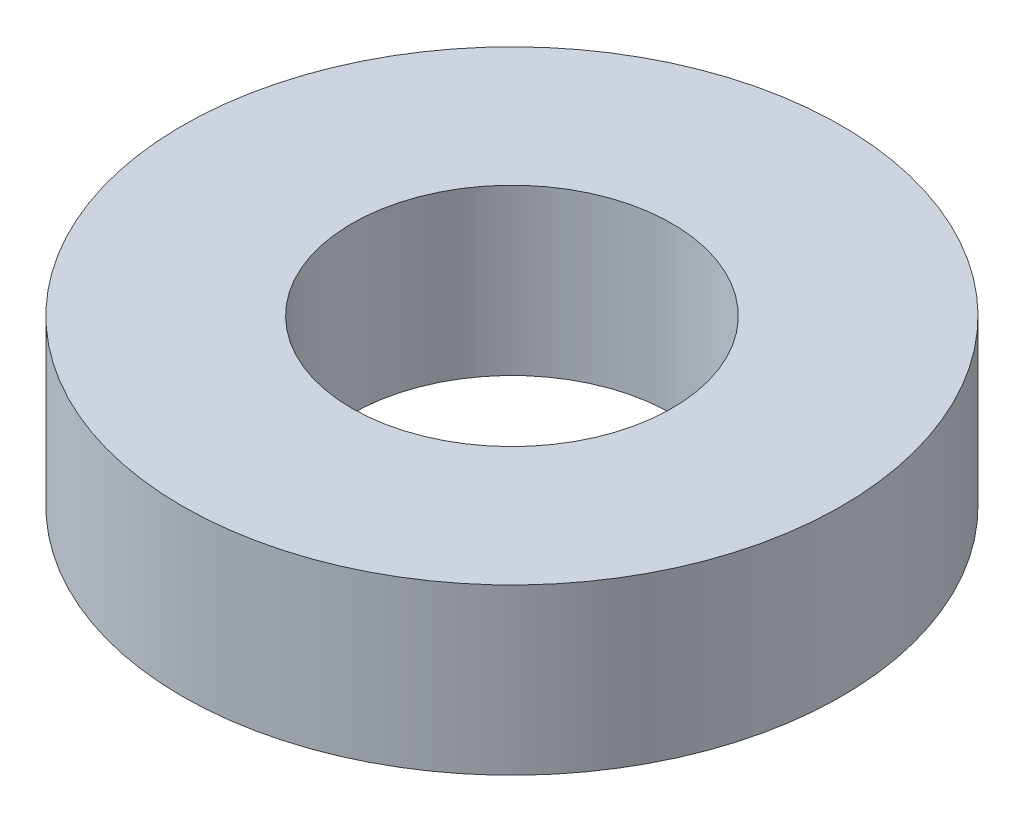
ISO-10303-21;
HEADER;
FILE_DESCRIPTION(('STEP AP214'),'2;1');
FILE_NAME('part.step','',(''),(''),'','','');
FILE_SCHEMA(('AUTOMOTIVE_DESIGN { 1 0 10303 214 1 1 1 1 }'));
ENDSEC;
DATA;
#1=APPLICATION_CONTEXT('core data for automotive mechanical design processes');
#2=APPLICATION_PROTOCOL_DEFINITION('international standard','automotive_design',2000,#1);
#3=PRODUCT_CONTEXT('',#1,'mechanical');
#4=PRODUCT('Part','Part','',(#3));
#5=PRODUCT_RELATED_PRODUCT_CATEGORY('part','',(#4));
#6=PRODUCT_DEFINITION_FORMATION('','',#4);
#7=PRODUCT_DEFINITION_CONTEXT('part definition',#1,'design');
#8=PRODUCT_DEFINITION('design','',#6,#7);
#9=PRODUCT_DEFINITION_SHAPE('','',#8);
#10=(LENGTH_UNIT() NAMED_UNIT(*) SI_UNIT(.MILLI.,.METRE.));
#11=(NAMED_UNIT(*) PLANE_ANGLE_UNIT() SI_UNIT($,.RADIAN.));
#12=(NAMED_UNIT(*) SI_UNIT($,.STERADIAN.) SOLID_ANGLE_UNIT());
#13=UNCERTAINTY_MEASURE_WITH_UNIT(LENGTH_MEASURE(1.E-05),#10,'distance_accuracy_value','');
#14=(GEOMETRIC_REPRESENTATION_CONTEXT(3) GLOBAL_UNCERTAINTY_ASSIGNED_CONTEXT((#13)) GLOBAL_UNIT_ASSIGNED_CONTEXT((#10,
#11,#12)) REPRESENTATION_CONTEXT('',''));
#15=CARTESIAN_POINT('',(0.,0.,0.));
#16=DIRECTION('',(0.,0.,1.));
#17=DIRECTION('',(1.,0.,0.));
#18=AXIS2_PLACEMENT_3D('',#15,#16,#17);
#19=CARTESIAN_POINT('',(0.,1.75,0.));
#20=DIRECTION('',(0.,1.,0.));
#21=DIRECTION('',(0.,0.,1.));
#22=AXIS2_PLACEMENT_3D('',#19,#20,#21);
#23=PLANE('',#22);
#24=CARTESIAN_POINT('',(0.,1.75,0.));
#25=DIRECTION('',(0.,1.,0.));
#26=DIRECTION('',(0.,0.,1.));
#27=AXIS2_PLACEMENT_3D('',#24,#25,#26);
#28=CIRCLE('',#27,3.5);
#29=CARTESIAN_POINT('',(0.,1.75,3.5));
#30=VERTEX_POINT('',#29);
#31=EDGE_CURVE('E10',#30,#30,#28,.T.);
#32=ORIENTED_EDGE('',*,*,#31,.T.);
#33=EDGE_LOOP('',(#32));
#34=FACE_BOUND('',#33,.T.);
#35=CARTESIAN_POINT('',(0.,1.75,0.));
#36=DIRECTION('',(0.,1.,0.));
#37=DIRECTION('',(0.,0.,1.));
#38=AXIS2_PLACEMENT_3D('',#35,#36,#37);
#39=CIRCLE('',#38,1.7);
#40=CARTESIAN_POINT('',(0.,1.75,1.7));
#41=VERTEX_POINT('',#40);
#42=EDGE_CURVE('E48',#41,#41,#39,.T.);
#43=ORIENTED_EDGE('',*,*,#42,.F.);
#44=EDGE_LOOP('',(#43));
#45=FACE_BOUND('',#44,.T.);
#46=ADVANCED_FACE('F40',(#34,#45),#23,.T.);
#47=CARTESIAN_POINT('',(0.,0.,0.));
#48=DIRECTION('',(0.,1.,0.));
#49=DIRECTION('',(0.,0.,1.));
#50=AXIS2_PLACEMENT_3D('',#47,#48,#49);
#51=PLANE('',#50);
#52=CARTESIAN_POINT('',(0.,0.,0.));
#53=DIRECTION('',(0.,1.,0.));
#54=DIRECTION('',(0.,0.,1.));
#55=AXIS2_PLACEMENT_3D('',#52,#53,#54);
#56=CIRCLE('',#55,3.5);
#57=CARTESIAN_POINT('',(0.,0.,3.5));
#58=VERTEX_POINT('',#57);
#59=EDGE_CURVE('E41',#58,#58,#56,.T.);
#60=ORIENTED_EDGE('',*,*,#59,.F.);
#61=EDGE_LOOP('',(#60));
#62=FACE_BOUND('',#61,.T.);
#63=CARTESIAN_POINT('',(0.,0.,0.));
#64=DIRECTION('',(0.,1.,0.));
#65=DIRECTION('',(0.,0.,1.));
#66=AXIS2_PLACEMENT_3D('',#63,#64,#65);
#67=CIRCLE('',#66,1.7);
#68=CARTESIAN_POINT('',(0.,0.,1.7));
#69=VERTEX_POINT('',#68);
#70=EDGE_CURVE('E49',#69,#69,#67,.T.);
#71=ORIENTED_EDGE('',*,*,#70,.T.);
#72=EDGE_LOOP('',(#71));
#73=FACE_BOUND('',#72,.T.);
#74=ADVANCED_FACE('F58',(#62,#73),#51,.F.);
#75=CARTESIAN_POINT('',(0.,1.75,0.));
#76=DIRECTION('',(0.,-1.,0.));
#77=DIRECTION('',(0.,0.,-1.));
#78=AXIS2_PLACEMENT_3D('',#75,#76,#77);
#79=CYLINDRICAL_SURFACE('',#78,3.5);
#80=ORIENTED_EDGE('',*,*,#31,.F.);
#81=EDGE_LOOP('',(#80));
#82=FACE_BOUND('',#81,.T.);
#83=ORIENTED_EDGE('',*,*,#59,.T.);
#84=EDGE_LOOP('',(#83));
#85=FACE_BOUND('',#84,.T.);
#86=ADVANCED_FACE('F39',(#82,#85),#79,.T.);
#87=CARTESIAN_POINT('',(0.,1.75,0.));
#88=DIRECTION('',(0.,-1.,0.));
#89=DIRECTION('',(0.,0.,-1.));
#90=AXIS2_PLACEMENT_3D('',#87,#88,#89);
#91=CYLINDRICAL_SURFACE('',#90,1.7);
#92=ORIENTED_EDGE('',*,*,#42,.T.);
#93=EDGE_LOOP('',(#92));
#94=FACE_BOUND('',#93,.T.);
#95=ORIENTED_EDGE('',*,*,#70,.F.);
#96=EDGE_LOOP('',(#95));
#97=FACE_BOUND('',#96,.T.);
#98=ADVANCED_FACE('F57',(#94,#97),#91,.F.);
#99=CLOSED_SHELL('',(#46,#74,#86,#98));
#100=MANIFOLD_SOLID_BREP('B2',#99);
#101=ADVANCED_BREP_SHAPE_REPRESENTATION('',(#18,#100),#14);
#102=SHAPE_DEFINITION_REPRESENTATION(#9,#101);
ENDSEC;
END-ISO-10303-21;
